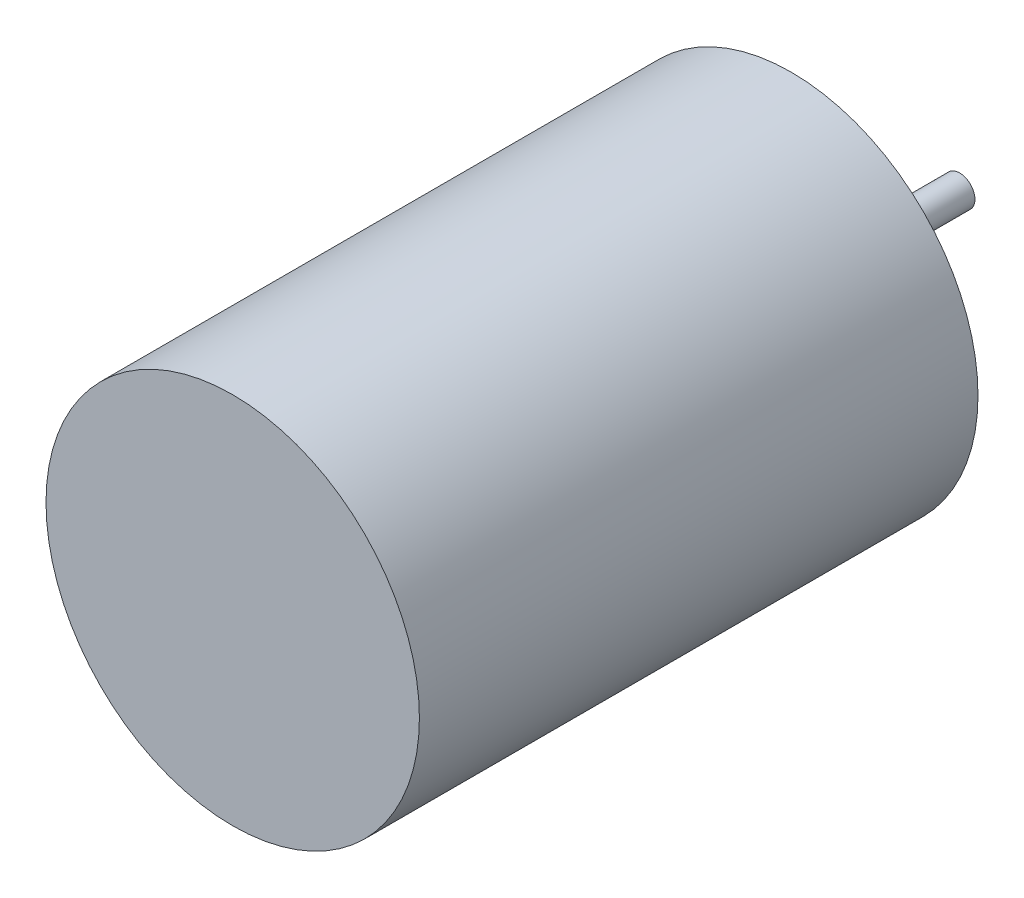
ISO-10303-21;
HEADER;
FILE_DESCRIPTION(('STEP AP214'),'2;1');
FILE_NAME('part.step','',(''),(''),'','','');
FILE_SCHEMA(('AUTOMOTIVE_DESIGN { 1 0 10303 214 1 1 1 1 }'));
ENDSEC;
DATA;
#1=APPLICATION_CONTEXT('core data for automotive mechanical design processes');
#2=APPLICATION_PROTOCOL_DEFINITION('international standard','automotive_design',2000,#1);
#3=PRODUCT_CONTEXT('',#1,'mechanical');
#4=PRODUCT('Part','Part','',(#3));
#5=PRODUCT_RELATED_PRODUCT_CATEGORY('part','',(#4));
#6=PRODUCT_DEFINITION_FORMATION('','',#4);
#7=PRODUCT_DEFINITION_CONTEXT('part definition',#1,'design');
#8=PRODUCT_DEFINITION('design','',#6,#7);
#9=PRODUCT_DEFINITION_SHAPE('','',#8);
#10=(LENGTH_UNIT() NAMED_UNIT(*) SI_UNIT(.MILLI.,.METRE.));
#11=(NAMED_UNIT(*) PLANE_ANGLE_UNIT() SI_UNIT($,.RADIAN.));
#12=(NAMED_UNIT(*) SI_UNIT($,.STERADIAN.) SOLID_ANGLE_UNIT());
#13=UNCERTAINTY_MEASURE_WITH_UNIT(LENGTH_MEASURE(1.E-05),#10,'distance_accuracy_value','');
#14=(GEOMETRIC_REPRESENTATION_CONTEXT(3) GLOBAL_UNCERTAINTY_ASSIGNED_CONTEXT((#13)) GLOBAL_UNIT_ASSIGNED_CONTEXT((#10,
#11,#12)) REPRESENTATION_CONTEXT('',''));
#15=CARTESIAN_POINT('',(0.,0.,0.));
#16=DIRECTION('',(0.,0.,1.));
#17=DIRECTION('',(1.,0.,0.));
#18=AXIS2_PLACEMENT_3D('',#15,#16,#17);
#19=CARTESIAN_POINT('',(0.,0.,36.5));
#20=DIRECTION('',(0.,0.,-1.));
#21=DIRECTION('',(-1.,0.,0.));
#22=AXIS2_PLACEMENT_3D('',#19,#20,#21);
#23=CYLINDRICAL_SURFACE('',#22,12.2);
#24=CARTESIAN_POINT('',(0.,0.,36.5));
#25=DIRECTION('',(0.,0.,1.));
#26=DIRECTION('',(1.,0.,0.));
#27=AXIS2_PLACEMENT_3D('',#24,#25,#26);
#28=CIRCLE('',#27,12.2);
#29=CARTESIAN_POINT('',(12.2,0.,36.5));
#30=VERTEX_POINT('',#29);
#31=EDGE_CURVE('E41',#30,#30,#28,.T.);
#32=ORIENTED_EDGE('',*,*,#31,.F.);
#33=EDGE_LOOP('',(#32));
#34=FACE_BOUND('',#33,.T.);
#35=CARTESIAN_POINT('',(0.,0.,0.));
#36=DIRECTION('',(0.,0.,1.));
#37=DIRECTION('',(1.,0.,0.));
#38=AXIS2_PLACEMENT_3D('',#35,#36,#37);
#39=CIRCLE('',#38,12.2);
#40=CARTESIAN_POINT('',(12.2,0.,0.));
#41=VERTEX_POINT('',#40);
#42=EDGE_CURVE('E45',#41,#41,#39,.T.);
#43=ORIENTED_EDGE('',*,*,#42,.T.);
#44=EDGE_LOOP('',(#43));
#45=FACE_BOUND('',#44,.T.);
#46=ADVANCED_FACE('F35',(#34,#45),#23,.T.);
#47=CARTESIAN_POINT('',(0.,0.,36.5));
#48=DIRECTION('',(0.,0.,1.));
#49=DIRECTION('',(1.,0.,0.));
#50=AXIS2_PLACEMENT_3D('',#47,#48,#49);
#51=PLANE('',#50);
#52=ORIENTED_EDGE('',*,*,#31,.T.);
#53=EDGE_LOOP('',(#52));
#54=FACE_BOUND('',#53,.T.);
#55=ADVANCED_FACE('F83',(#54),#51,.T.);
#56=CARTESIAN_POINT('',(0.,0.,0.));
#57=DIRECTION('',(0.,0.,1.));
#58=DIRECTION('',(1.,0.,0.));
#59=AXIS2_PLACEMENT_3D('',#56,#57,#58);
#60=PLANE('',#59);
#61=CARTESIAN_POINT('',(0.,-8.51201243817087,0.));
#62=DIRECTION('',(0.,0.,-1.));
#63=DIRECTION('',(-1.,0.,0.));
#64=AXIS2_PLACEMENT_3D('',#61,#62,#63);
#65=CIRCLE('',#64,1.5);
#66=CARTESIAN_POINT('',(-1.5,-8.51201243817087,0.));
#67=VERTEX_POINT('',#66);
#68=EDGE_CURVE('E65',#67,#67,#65,.T.);
#69=ORIENTED_EDGE('',*,*,#68,.F.);
#70=EDGE_LOOP('',(#69));
#71=FACE_BOUND('',#70,.T.);
#72=CARTESIAN_POINT('',(0.,8.50455718638354,0.));
#73=DIRECTION('',(0.,0.,-1.));
#74=DIRECTION('',(-1.,0.,0.));
#75=AXIS2_PLACEMENT_3D('',#72,#73,#74);
#76=CIRCLE('',#75,1.5);
#77=CARTESIAN_POINT('',(-1.5,8.50455718638354,0.));
#78=VERTEX_POINT('',#77);
#79=EDGE_CURVE('E71',#78,#78,#76,.T.);
#80=ORIENTED_EDGE('',*,*,#79,.F.);
#81=EDGE_LOOP('',(#80));
#82=FACE_BOUND('',#81,.T.);
#83=CARTESIAN_POINT('',(0.,0.,0.));
#84=DIRECTION('',(0.,0.,1.));
#85=DIRECTION('',(1.,0.,0.));
#86=AXIS2_PLACEMENT_3D('',#83,#84,#85);
#87=CIRCLE('',#86,3.225);
#88=CARTESIAN_POINT('',(3.225,0.,0.));
#89=VERTEX_POINT('',#88);
#90=EDGE_CURVE('E10',#89,#89,#87,.F.);
#91=ORIENTED_EDGE('',*,*,#90,.F.);
#92=EDGE_LOOP('',(#91));
#93=FACE_BOUND('',#92,.T.);
#94=ORIENTED_EDGE('',*,*,#42,.F.);
#95=EDGE_LOOP('',(#94));
#96=FACE_BOUND('',#95,.T.);
#97=ADVANCED_FACE('F79',(#71,#82,#93,#96),#60,.F.);
#98=CARTESIAN_POINT('',(0.,0.,-0.5));
#99=DIRECTION('',(0.,0.,1.));
#100=DIRECTION('',(1.,0.,0.));
#101=AXIS2_PLACEMENT_3D('',#98,#99,#100);
#102=CYLINDRICAL_SURFACE('',#101,3.225);
#103=CARTESIAN_POINT('',(0.,0.,-0.5));
#104=DIRECTION('',(0.,0.,-1.));
#105=DIRECTION('',(-1.,0.,0.));
#106=AXIS2_PLACEMENT_3D('',#103,#104,#105);
#107=CIRCLE('',#106,3.225);
#108=CARTESIAN_POINT('',(-3.225,0.,-0.5));
#109=VERTEX_POINT('',#108);
#110=EDGE_CURVE('E56',#109,#109,#107,.T.);
#111=ORIENTED_EDGE('',*,*,#110,.F.);
#112=EDGE_LOOP('',(#111));
#113=FACE_BOUND('',#112,.T.);
#114=ORIENTED_EDGE('',*,*,#90,.T.);
#115=EDGE_LOOP('',(#114));
#116=FACE_BOUND('',#115,.T.);
#117=ADVANCED_FACE('F82',(#113,#116),#102,.T.);
#118=CARTESIAN_POINT('',(0.,0.,-0.5));
#119=DIRECTION('',(0.,0.,-1.));
#120=DIRECTION('',(-1.,0.,0.));
#121=AXIS2_PLACEMENT_3D('',#118,#119,#120);
#122=PLANE('',#121);
#123=CARTESIAN_POINT('',(0.,0.,-0.5));
#124=DIRECTION('',(0.,0.,-1.));
#125=DIRECTION('',(-1.,0.,0.));
#126=AXIS2_PLACEMENT_3D('',#123,#124,#125);
#127=CIRCLE('',#126,1.);
#128=CARTESIAN_POINT('',(-1.,0.,-0.5));
#129=VERTEX_POINT('',#128);
#130=EDGE_CURVE('E54',#129,#129,#127,.T.);
#131=ORIENTED_EDGE('',*,*,#130,.F.);
#132=EDGE_LOOP('',(#131));
#133=FACE_BOUND('',#132,.T.);
#134=ORIENTED_EDGE('',*,*,#110,.T.);
#135=EDGE_LOOP('',(#134));
#136=FACE_BOUND('',#135,.T.);
#137=ADVANCED_FACE('F105',(#133,#136),#122,.T.);
#138=CARTESIAN_POINT('',(0.,0.,-11.));
#139=DIRECTION('',(0.,0.,-1.));
#140=DIRECTION('',(-1.,0.,0.));
#141=AXIS2_PLACEMENT_3D('',#138,#139,#140);
#142=PLANE('',#141);
#143=CARTESIAN_POINT('',(0.,0.,-11.));
#144=DIRECTION('',(0.,0.,-1.));
#145=DIRECTION('',(-1.,0.,0.));
#146=AXIS2_PLACEMENT_3D('',#143,#144,#145);
#147=CIRCLE('',#146,1.);
#148=CARTESIAN_POINT('',(-1.,0.,-11.));
#149=VERTEX_POINT('',#148);
#150=EDGE_CURVE('E50',#149,#149,#147,.T.);
#151=ORIENTED_EDGE('',*,*,#150,.T.);
#152=EDGE_LOOP('',(#151));
#153=FACE_BOUND('',#152,.T.);
#154=ADVANCED_FACE('F102',(#153),#142,.T.);
#155=CARTESIAN_POINT('',(0.,0.,-11.));
#156=DIRECTION('',(0.,0.,1.));
#157=DIRECTION('',(1.,0.,0.));
#158=AXIS2_PLACEMENT_3D('',#155,#156,#157);
#159=CYLINDRICAL_SURFACE('',#158,1.);
#160=ORIENTED_EDGE('',*,*,#130,.T.);
#161=EDGE_LOOP('',(#160));
#162=FACE_BOUND('',#161,.T.);
#163=ORIENTED_EDGE('',*,*,#150,.F.);
#164=EDGE_LOOP('',(#163));
#165=FACE_BOUND('',#164,.T.);
#166=ADVANCED_FACE('F98',(#162,#165),#159,.T.);
#167=CARTESIAN_POINT('',(0.,8.50455718638354,3.));
#168=DIRECTION('',(0.,0.,-1.));
#169=DIRECTION('',(-1.,0.,0.));
#170=AXIS2_PLACEMENT_3D('',#167,#168,#169);
#171=CYLINDRICAL_SURFACE('',#170,1.5);
#172=CARTESIAN_POINT('',(0.,8.50455718638354,3.));
#173=DIRECTION('',(0.,0.,-1.));
#174=DIRECTION('',(-1.,0.,0.));
#175=AXIS2_PLACEMENT_3D('',#172,#173,#174);
#176=CIRCLE('',#175,1.5);
#177=CARTESIAN_POINT('',(-1.5,8.50455718638354,3.));
#178=VERTEX_POINT('',#177);
#179=EDGE_CURVE('E68',#178,#178,#176,.T.);
#180=ORIENTED_EDGE('',*,*,#179,.F.);
#181=EDGE_LOOP('',(#180));
#182=FACE_BOUND('',#181,.T.);
#183=ORIENTED_EDGE('',*,*,#79,.T.);
#184=EDGE_LOOP('',(#183));
#185=FACE_BOUND('',#184,.T.);
#186=ADVANCED_FACE('F101',(#182,#185),#171,.F.);
#187=CARTESIAN_POINT('',(0.,8.50455718638354,3.));
#188=DIRECTION('',(0.,0.,-1.));
#189=DIRECTION('',(-1.,0.,0.));
#190=AXIS2_PLACEMENT_3D('',#187,#188,#189);
#191=PLANE('',#190);
#192=ORIENTED_EDGE('',*,*,#179,.T.);
#193=EDGE_LOOP('',(#192));
#194=FACE_BOUND('',#193,.T.);
#195=ADVANCED_FACE('F113',(#194),#191,.T.);
#196=CARTESIAN_POINT('',(0.,-8.51201243817087,3.));
#197=DIRECTION('',(0.,0.,-1.));
#198=DIRECTION('',(-1.,0.,0.));
#199=AXIS2_PLACEMENT_3D('',#196,#197,#198);
#200=CYLINDRICAL_SURFACE('',#199,1.5);
#201=CARTESIAN_POINT('',(0.,-8.51201243817087,3.));
#202=DIRECTION('',(0.,0.,-1.));
#203=DIRECTION('',(-1.,0.,0.));
#204=AXIS2_PLACEMENT_3D('',#201,#202,#203);
#205=CIRCLE('',#204,1.5);
#206=CARTESIAN_POINT('',(-1.5,-8.51201243817087,3.));
#207=VERTEX_POINT('',#206);
#208=EDGE_CURVE('E61',#207,#207,#205,.T.);
#209=ORIENTED_EDGE('',*,*,#208,.F.);
#210=EDGE_LOOP('',(#209));
#211=FACE_BOUND('',#210,.T.);
#212=ORIENTED_EDGE('',*,*,#68,.T.);
#213=EDGE_LOOP('',(#212));
#214=FACE_BOUND('',#213,.T.);
#215=ADVANCED_FACE('F77',(#211,#214),#200,.F.);
#216=CARTESIAN_POINT('',(0.,-8.51201243817087,3.));
#217=DIRECTION('',(0.,0.,-1.));
#218=DIRECTION('',(-1.,0.,0.));
#219=AXIS2_PLACEMENT_3D('',#216,#217,#218);
#220=PLANE('',#219);
#221=ORIENTED_EDGE('',*,*,#208,.T.);
#222=EDGE_LOOP('',(#221));
#223=FACE_BOUND('',#222,.T.);
#224=ADVANCED_FACE('F122',(#223),#220,.T.);
#225=CLOSED_SHELL('',(#46,#55,#97,#117,#137,#154,#166,#186,#195,#215,#224));
#226=MANIFOLD_SOLID_BREP('B2',#225);
#227=ADVANCED_BREP_SHAPE_REPRESENTATION('',(#18,#226),#14);
#228=SHAPE_DEFINITION_REPRESENTATION(#9,#227);
ENDSEC;
END-ISO-10303-21;
